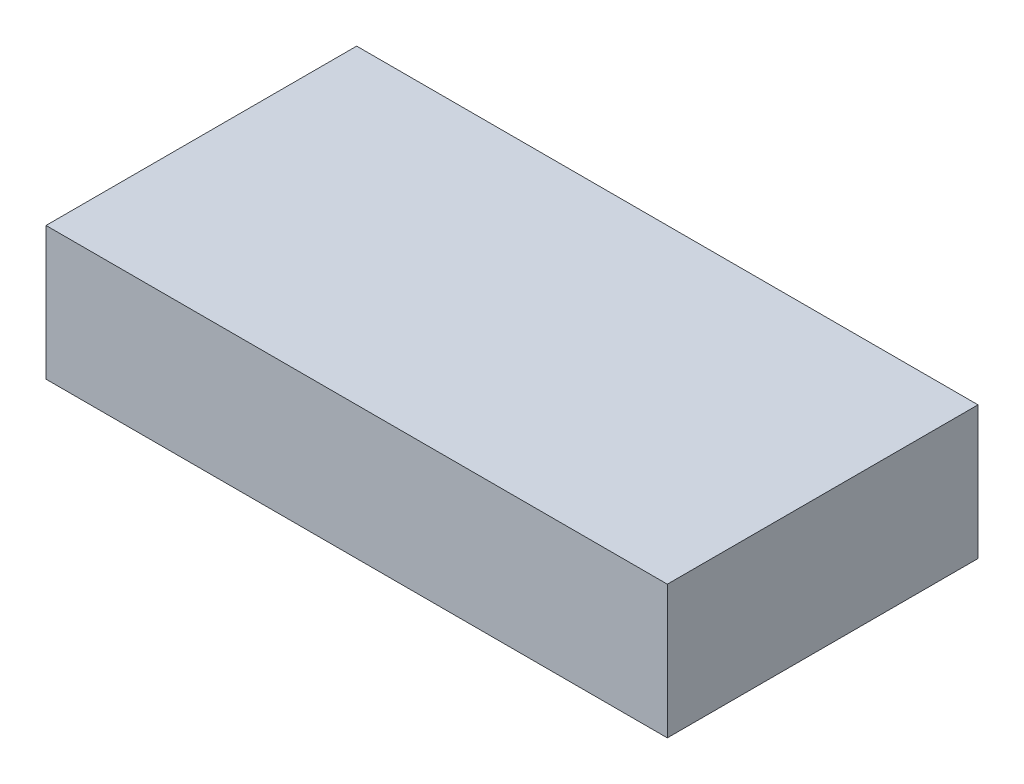
ISO-10303-21;
HEADER;
FILE_DESCRIPTION(('STEP AP214'),'2;1');
FILE_NAME('part.step','',(''),(''),'','','');
FILE_SCHEMA(('AUTOMOTIVE_DESIGN { 1 0 10303 214 1 1 1 1 }'));
ENDSEC;
DATA;
#1=APPLICATION_CONTEXT('core data for automotive mechanical design processes');
#2=APPLICATION_PROTOCOL_DEFINITION('international standard','automotive_design',2000,#1);
#3=PRODUCT_CONTEXT('',#1,'mechanical');
#4=PRODUCT('Part','Part','',(#3));
#5=PRODUCT_RELATED_PRODUCT_CATEGORY('part','',(#4));
#6=PRODUCT_DEFINITION_FORMATION('','',#4);
#7=PRODUCT_DEFINITION_CONTEXT('part definition',#1,'design');
#8=PRODUCT_DEFINITION('design','',#6,#7);
#9=PRODUCT_DEFINITION_SHAPE('','',#8);
#10=(LENGTH_UNIT() NAMED_UNIT(*) SI_UNIT(.MILLI.,.METRE.));
#11=(NAMED_UNIT(*) PLANE_ANGLE_UNIT() SI_UNIT($,.RADIAN.));
#12=(NAMED_UNIT(*) SI_UNIT($,.STERADIAN.) SOLID_ANGLE_UNIT());
#13=UNCERTAINTY_MEASURE_WITH_UNIT(LENGTH_MEASURE(1.E-05),#10,'distance_accuracy_value','');
#14=(GEOMETRIC_REPRESENTATION_CONTEXT(3) GLOBAL_UNCERTAINTY_ASSIGNED_CONTEXT((#13)) GLOBAL_UNIT_ASSIGNED_CONTEXT((#10,
#11,#12)) REPRESENTATION_CONTEXT('',''));
#15=CARTESIAN_POINT('',(0.,0.,0.));
#16=DIRECTION('',(0.,0.,1.));
#17=DIRECTION('',(1.,0.,0.));
#18=AXIS2_PLACEMENT_3D('',#15,#16,#17);
#19=CARTESIAN_POINT('',(44.45,19.05,-22.225));
#20=DIRECTION('',(0.,0.,1.));
#21=DIRECTION('',(1.,0.,0.));
#22=AXIS2_PLACEMENT_3D('',#19,#20,#21);
#23=PLANE('',#22);
#24=DIRECTION('',(-1.,0.,0.));
#25=VECTOR('',#24,1.);
#26=CARTESIAN_POINT('',(44.45,0.,-22.225));
#27=LINE('',#26,#25);
#28=CARTESIAN_POINT('',(44.45,0.,-22.225));
#29=VERTEX_POINT('',#28);
#30=CARTESIAN_POINT('',(-44.45,0.,-22.225));
#31=VERTEX_POINT('',#30);
#32=EDGE_CURVE('E96',#29,#31,#27,.T.);
#33=ORIENTED_EDGE('',*,*,#32,.T.);
#34=DIRECTION('',(0.,-1.,0.));
#35=VECTOR('',#34,1.);
#36=CARTESIAN_POINT('',(-44.45,19.05,-22.225));
#37=LINE('',#36,#35);
#38=CARTESIAN_POINT('',(-44.45,19.05,-22.225));
#39=VERTEX_POINT('',#38);
#40=EDGE_CURVE('E11',#39,#31,#37,.T.);
#41=ORIENTED_EDGE('',*,*,#40,.F.);
#42=DIRECTION('',(-1.,0.,0.));
#43=VECTOR('',#42,1.);
#44=CARTESIAN_POINT('',(44.45,19.05,-22.225));
#45=LINE('',#44,#43);
#46=CARTESIAN_POINT('',(44.45,19.05,-22.225));
#47=VERTEX_POINT('',#46);
#48=EDGE_CURVE('E84',#47,#39,#45,.T.);
#49=ORIENTED_EDGE('',*,*,#48,.F.);
#50=DIRECTION('',(0.,-1.,0.));
#51=VECTOR('',#50,1.);
#52=CARTESIAN_POINT('',(44.45,19.05,-22.225));
#53=LINE('',#52,#51);
#54=EDGE_CURVE('E92',#47,#29,#53,.T.);
#55=ORIENTED_EDGE('',*,*,#54,.T.);
#56=EDGE_LOOP('',(#33,#41,#49,#55));
#57=FACE_BOUND('',#56,.T.);
#58=ADVANCED_FACE('F33',(#57),#23,.F.);
#59=CARTESIAN_POINT('',(-44.45,19.05,-22.225));
#60=DIRECTION('',(1.,0.,0.));
#61=DIRECTION('',(0.,0.,-1.));
#62=AXIS2_PLACEMENT_3D('',#59,#60,#61);
#63=PLANE('',#62);
#64=DIRECTION('',(0.,0.,1.));
#65=VECTOR('',#64,1.);
#66=CARTESIAN_POINT('',(-44.45,0.,-22.225));
#67=LINE('',#66,#65);
#68=CARTESIAN_POINT('',(-44.45,0.,22.225));
#69=VERTEX_POINT('',#68);
#70=EDGE_CURVE('E88',#31,#69,#67,.T.);
#71=ORIENTED_EDGE('',*,*,#70,.T.);
#72=DIRECTION('',(0.,-1.,0.));
#73=VECTOR('',#72,1.);
#74=CARTESIAN_POINT('',(-44.45,19.05,22.225));
#75=LINE('',#74,#73);
#76=CARTESIAN_POINT('',(-44.45,19.05,22.225));
#77=VERTEX_POINT('',#76);
#78=EDGE_CURVE('E41',#77,#69,#75,.T.);
#79=ORIENTED_EDGE('',*,*,#78,.F.);
#80=DIRECTION('',(0.,0.,1.));
#81=VECTOR('',#80,1.);
#82=CARTESIAN_POINT('',(-44.45,19.05,-22.225));
#83=LINE('',#82,#81);
#84=EDGE_CURVE('E79',#39,#77,#83,.T.);
#85=ORIENTED_EDGE('',*,*,#84,.F.);
#86=ORIENTED_EDGE('',*,*,#40,.T.);
#87=EDGE_LOOP('',(#71,#79,#85,#86));
#88=FACE_BOUND('',#87,.T.);
#89=ADVANCED_FACE('F87',(#88),#63,.F.);
#90=CARTESIAN_POINT('',(44.45,19.05,22.225));
#91=DIRECTION('',(0.,0.,-1.));
#92=DIRECTION('',(-1.,0.,0.));
#93=AXIS2_PLACEMENT_3D('',#90,#91,#92);
#94=PLANE('',#93);
#95=DIRECTION('',(1.,0.,0.));
#96=VECTOR('',#95,1.);
#97=CARTESIAN_POINT('',(44.45,0.,22.225));
#98=LINE('',#97,#96);
#99=CARTESIAN_POINT('',(44.45,0.,22.225));
#100=VERTEX_POINT('',#99);
#101=EDGE_CURVE('E66',#69,#100,#98,.T.);
#102=ORIENTED_EDGE('',*,*,#101,.T.);
#103=DIRECTION('',(0.,-1.,0.));
#104=VECTOR('',#103,1.);
#105=CARTESIAN_POINT('',(44.45,19.05,22.225));
#106=LINE('',#105,#104);
#107=CARTESIAN_POINT('',(44.45,19.05,22.225));
#108=VERTEX_POINT('',#107);
#109=EDGE_CURVE('E89',#108,#100,#106,.T.);
#110=ORIENTED_EDGE('',*,*,#109,.F.);
#111=DIRECTION('',(1.,0.,0.));
#112=VECTOR('',#111,1.);
#113=CARTESIAN_POINT('',(44.45,19.05,22.225));
#114=LINE('',#113,#112);
#115=EDGE_CURVE('E82',#77,#108,#114,.T.);
#116=ORIENTED_EDGE('',*,*,#115,.F.);
#117=ORIENTED_EDGE('',*,*,#78,.T.);
#118=EDGE_LOOP('',(#102,#110,#116,#117));
#119=FACE_BOUND('',#118,.T.);
#120=ADVANCED_FACE('F90',(#119),#94,.F.);
#121=CARTESIAN_POINT('',(44.45,19.05,-22.225));
#122=DIRECTION('',(-1.,0.,0.));
#123=DIRECTION('',(0.,0.,1.));
#124=AXIS2_PLACEMENT_3D('',#121,#122,#123);
#125=PLANE('',#124);
#126=DIRECTION('',(0.,0.,-1.));
#127=VECTOR('',#126,1.);
#128=CARTESIAN_POINT('',(44.45,0.,-22.225));
#129=LINE('',#128,#127);
#130=EDGE_CURVE('E72',#100,#29,#129,.T.);
#131=ORIENTED_EDGE('',*,*,#130,.T.);
#132=ORIENTED_EDGE('',*,*,#54,.F.);
#133=DIRECTION('',(0.,0.,-1.));
#134=VECTOR('',#133,1.);
#135=CARTESIAN_POINT('',(44.45,19.05,-22.225));
#136=LINE('',#135,#134);
#137=EDGE_CURVE('E49',#108,#47,#136,.T.);
#138=ORIENTED_EDGE('',*,*,#137,.F.);
#139=ORIENTED_EDGE('',*,*,#109,.T.);
#140=EDGE_LOOP('',(#131,#132,#138,#139));
#141=FACE_BOUND('',#140,.T.);
#142=ADVANCED_FACE('F103',(#141),#125,.F.);
#143=CARTESIAN_POINT('',(0.,19.05,0.));
#144=DIRECTION('',(0.,1.,0.));
#145=DIRECTION('',(0.,0.,1.));
#146=AXIS2_PLACEMENT_3D('',#143,#144,#145);
#147=PLANE('',#146);
#148=ORIENTED_EDGE('',*,*,#48,.T.);
#149=ORIENTED_EDGE('',*,*,#84,.T.);
#150=ORIENTED_EDGE('',*,*,#115,.T.);
#151=ORIENTED_EDGE('',*,*,#137,.T.);
#152=EDGE_LOOP('',(#148,#149,#150,#151));
#153=FACE_BOUND('',#152,.T.);
#154=ADVANCED_FACE('F80',(#153),#147,.T.);
#155=CARTESIAN_POINT('',(0.,0.,0.));
#156=DIRECTION('',(0.,1.,0.));
#157=DIRECTION('',(0.,0.,1.));
#158=AXIS2_PLACEMENT_3D('',#155,#156,#157);
#159=PLANE('',#158);
#160=ORIENTED_EDGE('',*,*,#32,.F.);
#161=ORIENTED_EDGE('',*,*,#130,.F.);
#162=ORIENTED_EDGE('',*,*,#101,.F.);
#163=ORIENTED_EDGE('',*,*,#70,.F.);
#164=EDGE_LOOP('',(#160,#161,#162,#163));
#165=FACE_BOUND('',#164,.T.);
#166=ADVANCED_FACE('F106',(#165),#159,.F.);
#167=CLOSED_SHELL('',(#58,#89,#120,#142,#154,#166));
#168=MANIFOLD_SOLID_BREP('B2',#167);
#169=ADVANCED_BREP_SHAPE_REPRESENTATION('',(#18,#168),#14);
#170=SHAPE_DEFINITION_REPRESENTATION(#9,#169);
ENDSEC;
END-ISO-10303-21;
